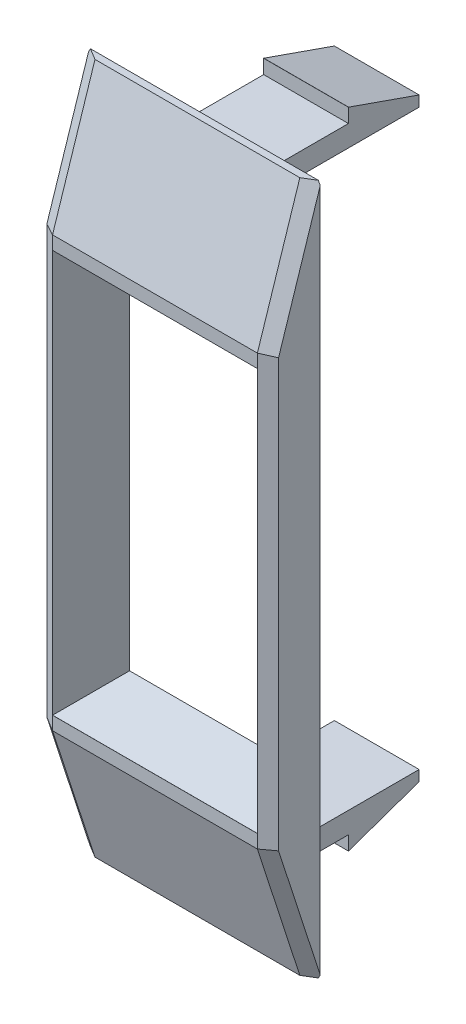
ISO-10303-21;
HEADER;
FILE_DESCRIPTION(('STEP AP214'),'2;1');
FILE_NAME('part.step','',(''),(''),'','','');
FILE_SCHEMA(('AUTOMOTIVE_DESIGN { 1 0 10303 214 1 1 1 1 }'));
ENDSEC;
DATA;
#1=APPLICATION_CONTEXT('core data for automotive mechanical design processes');
#2=APPLICATION_PROTOCOL_DEFINITION('international standard','automotive_design',2000,#1);
#3=PRODUCT_CONTEXT('',#1,'mechanical');
#4=PRODUCT('Part','Part','',(#3));
#5=PRODUCT_RELATED_PRODUCT_CATEGORY('part','',(#4));
#6=PRODUCT_DEFINITION_FORMATION('','',#4);
#7=PRODUCT_DEFINITION_CONTEXT('part definition',#1,'design');
#8=PRODUCT_DEFINITION('design','',#6,#7);
#9=PRODUCT_DEFINITION_SHAPE('','',#8);
#10=(LENGTH_UNIT() NAMED_UNIT(*) SI_UNIT(.MILLI.,.METRE.));
#11=(NAMED_UNIT(*) PLANE_ANGLE_UNIT() SI_UNIT($,.RADIAN.));
#12=(NAMED_UNIT(*) SI_UNIT($,.STERADIAN.) SOLID_ANGLE_UNIT());
#13=UNCERTAINTY_MEASURE_WITH_UNIT(LENGTH_MEASURE(1.E-05),#10,'distance_accuracy_value','');
#14=(GEOMETRIC_REPRESENTATION_CONTEXT(3) GLOBAL_UNCERTAINTY_ASSIGNED_CONTEXT((#13)) GLOBAL_UNIT_ASSIGNED_CONTEXT((#10,
#11,#12)) REPRESENTATION_CONTEXT('',''));
#15=CARTESIAN_POINT('',(0.,0.,0.));
#16=DIRECTION('',(0.,0.,1.));
#17=DIRECTION('',(1.,0.,0.));
#18=AXIS2_PLACEMENT_3D('',#15,#16,#17);
#19=CARTESIAN_POINT('',(-8.2,-24.45,3.5));
#20=DIRECTION('',(0.,0.,1.));
#21=DIRECTION('',(1.,0.,0.));
#22=AXIS2_PLACEMENT_3D('',#19,#20,#21);
#23=PLANE('',#22);
#24=DIRECTION('',(-1.,0.,0.));
#25=VECTOR('',#24,1.);
#26=CARTESIAN_POINT('',(-8.2,15.1999999999999,3.5));
#27=LINE('',#26,#25);
#28=CARTESIAN_POINT('',(7.24999999999999,15.1999999999999,3.5));
#29=VERTEX_POINT('',#28);
#30=CARTESIAN_POINT('',(-7.24999999999999,15.1999999999999,3.5));
#31=VERTEX_POINT('',#30);
#32=EDGE_CURVE('E388',#29,#31,#27,.T.);
#33=ORIENTED_EDGE('',*,*,#32,.T.);
#34=DIRECTION('',(0.,-1.,0.));
#35=VECTOR('',#34,1.);
#36=CARTESIAN_POINT('',(-7.24999999999999,-15.1999999999999,3.5));
#37=LINE('',#36,#35);
#38=CARTESIAN_POINT('',(-7.25,14.25,3.5));
#39=VERTEX_POINT('',#38);
#40=EDGE_CURVE('E430',#31,#39,#37,.T.);
#41=ORIENTED_EDGE('',*,*,#40,.T.);
#42=DIRECTION('',(1.,0.,0.));
#43=VECTOR('',#42,1.);
#44=CARTESIAN_POINT('',(-4.098750431034,14.25,3.5));
#45=LINE('',#44,#43);
#46=CARTESIAN_POINT('',(7.25,14.25,3.5));
#47=VERTEX_POINT('',#46);
#48=EDGE_CURVE('E372',#39,#47,#45,.T.);
#49=ORIENTED_EDGE('',*,*,#48,.T.);
#50=DIRECTION('',(0.,1.,0.));
#51=VECTOR('',#50,1.);
#52=CARTESIAN_POINT('',(7.24999999999999,-24.45,3.5));
#53=LINE('',#52,#51);
#54=EDGE_CURVE('E424',#47,#29,#53,.T.);
#55=ORIENTED_EDGE('',*,*,#54,.T.);
#56=EDGE_LOOP('',(#33,#41,#49,#55));
#57=FACE_BOUND('',#56,.T.);
#58=ADVANCED_FACE('F41',(#57),#23,.T.);
#59=CARTESIAN_POINT('',(-8.2,-24.45,0.));
#60=DIRECTION('',(1.,0.,0.));
#61=DIRECTION('',(0.,1.,0.));
#62=AXIS2_PLACEMENT_3D('',#59,#60,#61);
#63=PLANE('',#62);
#64=DIRECTION('',(0.,1.,0.));
#65=VECTOR('',#64,1.);
#66=CARTESIAN_POINT('',(-8.2,-24.45,0.));
#67=LINE('',#66,#65);
#68=CARTESIAN_POINT('',(-8.2,-24.1969648980842,0.));
#69=VERTEX_POINT('',#68);
#70=CARTESIAN_POINT('',(-8.2,24.1969648980842,0.));
#71=VERTEX_POINT('',#70);
#72=EDGE_CURVE('E347',#69,#71,#67,.T.);
#73=ORIENTED_EDGE('',*,*,#72,.F.);
#74=DIRECTION('',(0.,0.951056516295155,0.309016994374945));
#75=VECTOR('',#74,1.);
#76=CARTESIAN_POINT('',(-8.2,-15.0305095073577,2.97836190108732));
#77=LINE('',#76,#75);
#78=CARTESIAN_POINT('',(-8.2,-15.1131288657059,2.95151724426985));
#79=VERTEX_POINT('',#78);
#80=EDGE_CURVE('E405',#69,#79,#77,.T.);
#81=ORIENTED_EDGE('',*,*,#80,.T.);
#82=DIRECTION('',(0.,1.,0.));
#83=VECTOR('',#82,1.);
#84=CARTESIAN_POINT('',(-8.2,15.1999999999999,2.95151724426985));
#85=LINE('',#84,#83);
#86=CARTESIAN_POINT('',(-8.2,15.1131288657059,2.95151724426985));
#87=VERTEX_POINT('',#86);
#88=EDGE_CURVE('E403',#79,#87,#85,.T.);
#89=ORIENTED_EDGE('',*,*,#88,.T.);
#90=DIRECTION('',(0.,0.951056516295155,-0.309016994374945));
#91=VECTOR('',#90,1.);
#92=CARTESIAN_POINT('',(-8.2,24.2805095073578,-0.0271452890670657));
#93=LINE('',#92,#91);
#94=EDGE_CURVE('E401',#87,#71,#93,.T.);
#95=ORIENTED_EDGE('',*,*,#94,.T.);
#96=EDGE_LOOP('',(#73,#81,#89,#95));
#97=FACE_BOUND('',#96,.T.);
#98=ADVANCED_FACE('F687',(#97),#63,.F.);
#99=CARTESIAN_POINT('',(-8.2,-24.45,0.));
#100=DIRECTION('',(0.,1.,0.));
#101=DIRECTION('',(1.,0.,0.));
#102=AXIS2_PLACEMENT_3D('',#99,#100,#101);
#103=PLANE('',#102);
#104=DIRECTION('',(-1.,0.,0.));
#105=VECTOR('',#104,1.);
#106=CARTESIAN_POINT('',(-8.2,-24.45,0.494492809845614));
#107=LINE('',#106,#105);
#108=CARTESIAN_POINT('',(7.24999999999999,-24.45,0.494492809845614));
#109=VERTEX_POINT('',#108);
#110=CARTESIAN_POINT('',(-7.24999999999999,-24.45,0.494492809845614));
#111=VERTEX_POINT('',#110);
#112=EDGE_CURVE('E395',#109,#111,#107,.T.);
#113=ORIENTED_EDGE('',*,*,#112,.T.);
#114=DIRECTION('',(-0.854818176331533,0.,-0.518927630227213));
#115=VECTOR('',#114,1.);
#116=CARTESIAN_POINT('',(-8.19651741213546,-24.45,-0.0801019417027585));
#117=LINE('',#116,#115);
#118=CARTESIAN_POINT('',(-8.06456722922269,-24.45,0.));
#119=VERTEX_POINT('',#118);
#120=EDGE_CURVE('E414',#111,#119,#117,.T.);
#121=ORIENTED_EDGE('',*,*,#120,.T.);
#122=DIRECTION('',(1.,0.,0.));
#123=VECTOR('',#122,1.);
#124=CARTESIAN_POINT('',(-8.2,-24.45,0.));
#125=LINE('',#124,#123);
#126=CARTESIAN_POINT('',(8.06456722922269,-24.45,0.));
#127=VERTEX_POINT('',#126);
#128=EDGE_CURVE('E392',#119,#127,#125,.T.);
#129=ORIENTED_EDGE('',*,*,#128,.T.);
#130=DIRECTION('',(0.854818176331533,0.,-0.518927630227213));
#131=VECTOR('',#130,1.);
#132=CARTESIAN_POINT('',(8.19651741213546,-24.45,-0.0801019417027585));
#133=LINE('',#132,#131);
#134=EDGE_CURVE('E412',#127,#109,#133,.F.);
#135=ORIENTED_EDGE('',*,*,#134,.T.);
#136=EDGE_LOOP('',(#113,#121,#129,#135));
#137=FACE_BOUND('',#136,.T.);
#138=ADVANCED_FACE('F692',(#137),#103,.F.);
#139=DIRECTION('',(1.,0.,0.));
#140=VECTOR('',#139,1.);
#141=CARTESIAN_POINT('',(-4.098750431034,-14.25,3.5));
#142=LINE('',#141,#140);
#143=CARTESIAN_POINT('',(-7.25,-14.25,3.5));
#144=VERTEX_POINT('',#143);
#145=CARTESIAN_POINT('',(7.25,-14.25,3.5));
#146=VERTEX_POINT('',#145);
#147=EDGE_CURVE('E491',#144,#146,#142,.T.);
#148=ORIENTED_EDGE('',*,*,#147,.F.);
#149=DIRECTION('',(0.,-1.,0.));
#150=VECTOR('',#149,1.);
#151=CARTESIAN_POINT('',(-7.24999999999999,-15.1999999999999,3.5));
#152=LINE('',#151,#150);
#153=CARTESIAN_POINT('',(-7.24999999999999,-15.1999999999999,3.5));
#154=VERTEX_POINT('',#153);
#155=EDGE_CURVE('E428',#144,#154,#152,.T.);
#156=ORIENTED_EDGE('',*,*,#155,.T.);
#157=DIRECTION('',(1.,0.,0.));
#158=VECTOR('',#157,1.);
#159=CARTESIAN_POINT('',(8.2,-15.1999999999999,3.5));
#160=LINE('',#159,#158);
#161=CARTESIAN_POINT('',(7.24999999999999,-15.1999999999999,3.5));
#162=VERTEX_POINT('',#161);
#163=EDGE_CURVE('E391',#154,#162,#160,.T.);
#164=ORIENTED_EDGE('',*,*,#163,.T.);
#165=DIRECTION('',(0.,1.,0.));
#166=VECTOR('',#165,1.);
#167=CARTESIAN_POINT('',(7.24999999999999,-24.45,3.5));
#168=LINE('',#167,#166);
#169=EDGE_CURVE('E426',#162,#146,#168,.T.);
#170=ORIENTED_EDGE('',*,*,#169,.T.);
#171=EDGE_LOOP('',(#148,#156,#164,#170));
#172=FACE_BOUND('',#171,.T.);
#173=ADVANCED_FACE('F490',(#172),#23,.T.);
#174=CARTESIAN_POINT('',(-8.2,24.45,0.));
#175=DIRECTION('',(0.,1.,0.));
#176=DIRECTION('',(1.,0.,0.));
#177=AXIS2_PLACEMENT_3D('',#174,#175,#176);
#178=PLANE('',#177);
#179=DIRECTION('',(1.,0.,0.));
#180=VECTOR('',#179,1.);
#181=CARTESIAN_POINT('',(-8.2,24.45,0.));
#182=LINE('',#181,#180);
#183=CARTESIAN_POINT('',(-8.06456722922269,24.45,0.));
#184=VERTEX_POINT('',#183);
#185=CARTESIAN_POINT('',(8.06456722922269,24.45,0.));
#186=VERTEX_POINT('',#185);
#187=EDGE_CURVE('E342',#184,#186,#182,.T.);
#188=ORIENTED_EDGE('',*,*,#187,.F.);
#189=DIRECTION('',(-0.854818176331534,0.,-0.518927630227212));
#190=VECTOR('',#189,1.);
#191=CARTESIAN_POINT('',(-8.16352986640727,24.45,-0.0600764562770703));
#192=LINE('',#191,#190);
#193=CARTESIAN_POINT('',(-7.24999999999999,24.45,0.494492809845614));
#194=VERTEX_POINT('',#193);
#195=EDGE_CURVE('E434',#184,#194,#192,.F.);
#196=ORIENTED_EDGE('',*,*,#195,.T.);
#197=DIRECTION('',(1.,0.,0.));
#198=VECTOR('',#197,1.);
#199=CARTESIAN_POINT('',(-8.2,24.45,0.494492809845614));
#200=LINE('',#199,#198);
#201=CARTESIAN_POINT('',(7.24999999999999,24.45,0.494492809845614));
#202=VERTEX_POINT('',#201);
#203=EDGE_CURVE('E398',#194,#202,#200,.T.);
#204=ORIENTED_EDGE('',*,*,#203,.T.);
#205=DIRECTION('',(0.854818176331534,0.,-0.518927630227212));
#206=VECTOR('',#205,1.);
#207=CARTESIAN_POINT('',(-3.82018161281575,24.45,7.21477938023241));
#208=LINE('',#207,#206);
#209=EDGE_CURVE('E432',#202,#186,#208,.T.);
#210=ORIENTED_EDGE('',*,*,#209,.T.);
#211=EDGE_LOOP('',(#188,#196,#204,#210));
#212=FACE_BOUND('',#211,.T.);
#213=ADVANCED_FACE('F462',(#212),#178,.T.);
#214=CARTESIAN_POINT('',(-8.2,-24.45,0.));
#215=DIRECTION('',(0.,0.,1.));
#216=DIRECTION('',(1.,0.,0.));
#217=AXIS2_PLACEMENT_3D('',#214,#215,#216);
#218=PLANE('',#217);
#219=ORIENTED_EDGE('',*,*,#128,.F.);
#220=DIRECTION('',(-0.471891765427951,0.881656487369821,0.));
#221=VECTOR('',#220,1.);
#222=CARTESIAN_POINT('',(-8.10477845370252,-24.3748715711418,0.));
#223=LINE('',#222,#221);
#224=EDGE_CURVE('E422',#119,#69,#223,.T.);
#225=ORIENTED_EDGE('',*,*,#224,.T.);
#226=ORIENTED_EDGE('',*,*,#72,.T.);
#227=DIRECTION('',(-0.471891765427951,-0.881656487369821,0.));
#228=VECTOR('',#227,1.);
#229=CARTESIAN_POINT('',(-26.5067060072025,-10.0062725730865,0.));
#230=LINE('',#229,#228);
#231=EDGE_CURVE('E420',#71,#184,#230,.F.);
#232=ORIENTED_EDGE('',*,*,#231,.T.);
#233=ORIENTED_EDGE('',*,*,#187,.T.);
#234=DIRECTION('',(0.471891765427951,-0.881656487369821,0.));
#235=VECTOR('',#234,1.);
#236=CARTESIAN_POINT('',(26.5067060072025,-10.0062725730865,0.));
#237=LINE('',#236,#235);
#238=CARTESIAN_POINT('',(8.2,24.1969648980842,0.));
#239=VERTEX_POINT('',#238);
#240=EDGE_CURVE('E416',#186,#239,#237,.T.);
#241=ORIENTED_EDGE('',*,*,#240,.T.);
#242=DIRECTION('',(0.,1.,0.));
#243=VECTOR('',#242,1.);
#244=CARTESIAN_POINT('',(8.2,-24.45,0.));
#245=LINE('',#244,#243);
#246=CARTESIAN_POINT('',(8.2,-24.1969648980842,0.));
#247=VERTEX_POINT('',#246);
#248=EDGE_CURVE('E506',#247,#239,#245,.T.);
#249=ORIENTED_EDGE('',*,*,#248,.F.);
#250=DIRECTION('',(0.471891765427951,0.881656487369821,0.));
#251=VECTOR('',#250,1.);
#252=CARTESIAN_POINT('',(8.10477845370252,-24.3748715711418,0.));
#253=LINE('',#252,#251);
#254=EDGE_CURVE('E418',#247,#127,#253,.F.);
#255=ORIENTED_EDGE('',*,*,#254,.T.);
#256=EDGE_LOOP('',(#219,#225,#226,#232,#233,#241,#249,#255));
#257=FACE_BOUND('',#256,.T.);
#258=DIRECTION('',(0.,-1.,0.));
#259=VECTOR('',#258,1.);
#260=CARTESIAN_POINT('',(3.,-20.3,0.));
#261=LINE('',#260,#259);
#262=CARTESIAN_POINT('',(3.,-20.3,0.));
#263=VERTEX_POINT('',#262);
#264=CARTESIAN_POINT('',(3.,-21.8,0.));
#265=VERTEX_POINT('',#264);
#266=EDGE_CURVE('E557',#263,#265,#261,.T.);
#267=ORIENTED_EDGE('',*,*,#266,.F.);
#268=DIRECTION('',(1.,0.,0.));
#269=VECTOR('',#268,1.);
#270=CARTESIAN_POINT('',(-3.,-20.3,0.));
#271=LINE('',#270,#269);
#272=CARTESIAN_POINT('',(-3.,-20.3,0.));
#273=VERTEX_POINT('',#272);
#274=EDGE_CURVE('E602',#273,#263,#271,.T.);
#275=ORIENTED_EDGE('',*,*,#274,.F.);
#276=DIRECTION('',(0.,-1.,0.));
#277=VECTOR('',#276,1.);
#278=CARTESIAN_POINT('',(-3.,-20.3,0.));
#279=LINE('',#278,#277);
#280=CARTESIAN_POINT('',(-3.,-21.8,0.));
#281=VERTEX_POINT('',#280);
#282=EDGE_CURVE('E334',#273,#281,#279,.T.);
#283=ORIENTED_EDGE('',*,*,#282,.T.);
#284=DIRECTION('',(1.,0.,0.));
#285=VECTOR('',#284,1.);
#286=CARTESIAN_POINT('',(-3.,-21.8,0.));
#287=LINE('',#286,#285);
#288=EDGE_CURVE('E330',#281,#265,#287,.T.);
#289=ORIENTED_EDGE('',*,*,#288,.T.);
#290=EDGE_LOOP('',(#267,#275,#283,#289));
#291=FACE_BOUND('',#290,.T.);
#292=DIRECTION('',(0.,1.,0.));
#293=VECTOR('',#292,1.);
#294=CARTESIAN_POINT('',(5.298848569435,-11.44391076668,0.));
#295=LINE('',#294,#293);
#296=CARTESIAN_POINT('',(5.298848569435,-12.29884856943,0.));
#297=VERTEX_POINT('',#296);
#298=CARTESIAN_POINT('',(5.298848569435,12.298848569435,0.));
#299=VERTEX_POINT('',#298);
#300=EDGE_CURVE('E335',#297,#299,#295,.T.);
#301=ORIENTED_EDGE('',*,*,#300,.T.);
#302=DIRECTION('',(1.,0.,0.));
#303=VECTOR('',#302,1.);
#304=CARTESIAN_POINT('',(-4.838538791494,12.298848569435,0.));
#305=LINE('',#304,#303);
#306=CARTESIAN_POINT('',(-5.298848569435,12.298848569435,0.));
#307=VERTEX_POINT('',#306);
#308=EDGE_CURVE('E382',#307,#299,#305,.T.);
#309=ORIENTED_EDGE('',*,*,#308,.F.);
#310=DIRECTION('',(0.,-1.,0.));
#311=VECTOR('',#310,1.);
#312=CARTESIAN_POINT('',(-5.298848569435,-11.44391076668,0.));
#313=LINE('',#312,#311);
#314=CARTESIAN_POINT('',(-5.298848569435,-12.29884856943,0.));
#315=VERTEX_POINT('',#314);
#316=EDGE_CURVE('E354',#307,#315,#313,.T.);
#317=ORIENTED_EDGE('',*,*,#316,.T.);
#318=DIRECTION('',(1.,0.,0.));
#319=VECTOR('',#318,1.);
#320=CARTESIAN_POINT('',(-4.338538791494,-12.29884856943,0.));
#321=LINE('',#320,#319);
#322=EDGE_CURVE('E358',#315,#297,#321,.T.);
#323=ORIENTED_EDGE('',*,*,#322,.T.);
#324=EDGE_LOOP('',(#301,#309,#317,#323));
#325=FACE_BOUND('',#324,.T.);
#326=DIRECTION('',(1.,0.,0.));
#327=VECTOR('',#326,1.);
#328=CARTESIAN_POINT('',(-3.,20.3,0.));
#329=LINE('',#328,#327);
#330=CARTESIAN_POINT('',(-3.,20.3,0.));
#331=VERTEX_POINT('',#330);
#332=CARTESIAN_POINT('',(3.,20.3,0.));
#333=VERTEX_POINT('',#332);
#334=EDGE_CURVE('E383',#331,#333,#329,.T.);
#335=ORIENTED_EDGE('',*,*,#334,.T.);
#336=DIRECTION('',(0.,1.,0.));
#337=VECTOR('',#336,1.);
#338=CARTESIAN_POINT('',(3.,20.3,0.));
#339=LINE('',#338,#337);
#340=CARTESIAN_POINT('',(3.,21.8,0.));
#341=VERTEX_POINT('',#340);
#342=EDGE_CURVE('E387',#333,#341,#339,.T.);
#343=ORIENTED_EDGE('',*,*,#342,.T.);
#344=DIRECTION('',(1.,0.,0.));
#345=VECTOR('',#344,1.);
#346=CARTESIAN_POINT('',(-3.,21.8,0.));
#347=LINE('',#346,#345);
#348=CARTESIAN_POINT('',(-3.,21.8,0.));
#349=VERTEX_POINT('',#348);
#350=EDGE_CURVE('E302',#349,#341,#347,.T.);
#351=ORIENTED_EDGE('',*,*,#350,.F.);
#352=DIRECTION('',(0.,1.,0.));
#353=VECTOR('',#352,1.);
#354=CARTESIAN_POINT('',(-3.,20.3,0.));
#355=LINE('',#354,#353);
#356=EDGE_CURVE('E298',#331,#349,#355,.T.);
#357=ORIENTED_EDGE('',*,*,#356,.F.);
#358=EDGE_LOOP('',(#335,#343,#351,#357));
#359=FACE_BOUND('',#358,.T.);
#360=ADVANCED_FACE('F657',(#257,#291,#325,#359),#218,.F.);
#361=CARTESIAN_POINT('',(8.2,-24.45,0.));
#362=DIRECTION('',(1.,0.,0.));
#363=DIRECTION('',(0.,1.,0.));
#364=AXIS2_PLACEMENT_3D('',#361,#362,#363);
#365=PLANE('',#364);
#366=DIRECTION('',(0.,-1.,0.));
#367=VECTOR('',#366,1.);
#368=CARTESIAN_POINT('',(8.2,-24.45,2.95151724426985));
#369=LINE('',#368,#367);
#370=CARTESIAN_POINT('',(8.2,15.1131288657059,2.95151724426985));
#371=VERTEX_POINT('',#370);
#372=CARTESIAN_POINT('',(8.2,-15.1131288657059,2.95151724426985));
#373=VERTEX_POINT('',#372);
#374=EDGE_CURVE('E51',#371,#373,#369,.T.);
#375=ORIENTED_EDGE('',*,*,#374,.T.);
#376=DIRECTION('',(0.,-0.951056516295155,-0.309016994374945));
#377=VECTOR('',#376,1.);
#378=CARTESIAN_POINT('',(8.2,-24.4258372978537,-0.0743651506092102));
#379=LINE('',#378,#377);
#380=EDGE_CURVE('E11',#373,#247,#379,.T.);
#381=ORIENTED_EDGE('',*,*,#380,.T.);
#382=ORIENTED_EDGE('',*,*,#248,.T.);
#383=DIRECTION('',(0.,-0.951056516295155,0.309016994374945));
#384=VECTOR('',#383,1.);
#385=CARTESIAN_POINT('',(8.2,-19.8046282146138,14.2969842679416));
#386=LINE('',#385,#384);
#387=EDGE_CURVE('E62',#239,#371,#386,.T.);
#388=ORIENTED_EDGE('',*,*,#387,.T.);
#389=EDGE_LOOP('',(#375,#381,#382,#388));
#390=FACE_BOUND('',#389,.T.);
#391=ADVANCED_FACE('F709',(#390),#365,.T.);
#392=CARTESIAN_POINT('',(0.002499137931137,-14.25,3.502499137931));
#393=DIRECTION('',(0.,-1.,0.));
#394=DIRECTION('',(0.,0.,-1.));
#395=AXIS2_PLACEMENT_3D('',#392,#393,#394);
#396=PLANE('',#395);
#397=DIRECTION('',(0.,0.,1.));
#398=VECTOR('',#397,1.);
#399=CARTESIAN_POINT('',(-7.25,-14.25,3.495));
#400=LINE('',#399,#398);
#401=CARTESIAN_POINT('',(-7.25,-14.25,3.495));
#402=VERTEX_POINT('',#401);
#403=EDGE_CURVE('E498',#402,#144,#400,.T.);
#404=ORIENTED_EDGE('',*,*,#403,.T.);
#405=ORIENTED_EDGE('',*,*,#147,.T.);
#406=DIRECTION('',(0.,0.,1.));
#407=VECTOR('',#406,1.);
#408=CARTESIAN_POINT('',(7.25,-14.25,3.495));
#409=LINE('',#408,#407);
#410=CARTESIAN_POINT('',(7.25,-14.25,3.495));
#411=VERTEX_POINT('',#410);
#412=EDGE_CURVE('E341',#411,#146,#409,.T.);
#413=ORIENTED_EDGE('',*,*,#412,.F.);
#414=DIRECTION('',(-1.,0.,0.));
#415=VECTOR('',#414,1.);
#416=CARTESIAN_POINT('',(7.25,-14.25,3.495));
#417=LINE('',#416,#415);
#418=EDGE_CURVE('E340',#411,#402,#417,.T.);
#419=ORIENTED_EDGE('',*,*,#418,.T.);
#420=EDGE_LOOP('',(#404,#405,#413,#419));
#421=FACE_BOUND('',#420,.T.);
#422=ADVANCED_FACE('F495',(#421),#396,.F.);
#423=CARTESIAN_POINT('',(7.25,-0.002499561403522,3.497500438596));
#424=DIRECTION('',(-1.,0.,0.));
#425=DIRECTION('',(0.,0.,1.));
#426=AXIS2_PLACEMENT_3D('',#423,#424,#425);
#427=PLANE('',#426);
#428=DIRECTION('',(0.,0.,1.));
#429=VECTOR('',#428,1.);
#430=CARTESIAN_POINT('',(7.25,14.25,3.495));
#431=LINE('',#430,#429);
#432=CARTESIAN_POINT('',(7.25,14.25,3.495));
#433=VERTEX_POINT('',#432);
#434=EDGE_CURVE('E350',#433,#47,#431,.T.);
#435=ORIENTED_EDGE('',*,*,#434,.F.);
#436=DIRECTION('',(0.,-1.,0.));
#437=VECTOR('',#436,1.);
#438=CARTESIAN_POINT('',(7.25,14.25,3.495));
#439=LINE('',#438,#437);
#440=EDGE_CURVE('E336',#433,#411,#439,.T.);
#441=ORIENTED_EDGE('',*,*,#440,.T.);
#442=ORIENTED_EDGE('',*,*,#412,.T.);
#443=DIRECTION('',(0.,-1.,0.));
#444=VECTOR('',#443,1.);
#445=CARTESIAN_POINT('',(7.25,-12.2262497807,3.5));
#446=LINE('',#445,#444);
#447=EDGE_CURVE('E346',#47,#146,#446,.T.);
#448=ORIENTED_EDGE('',*,*,#447,.F.);
#449=EDGE_LOOP('',(#435,#441,#442,#448));
#450=FACE_BOUND('',#449,.T.);
#451=ADVANCED_FACE('F483',(#450),#427,.T.);
#452=CARTESIAN_POINT('',(0.002499137931137,14.25,3.497500862069));
#453=DIRECTION('',(0.,-1.,0.));
#454=DIRECTION('',(0.,0.,-1.));
#455=AXIS2_PLACEMENT_3D('',#452,#453,#454);
#456=PLANE('',#455);
#457=DIRECTION('',(0.,0.,-1.));
#458=VECTOR('',#457,1.);
#459=CARTESIAN_POINT('',(-7.25,14.25,3.505));
#460=LINE('',#459,#458);
#461=CARTESIAN_POINT('',(-7.25,14.25,3.495));
#462=VERTEX_POINT('',#461);
#463=EDGE_CURVE('E527',#39,#462,#460,.T.);
#464=ORIENTED_EDGE('',*,*,#463,.T.);
#465=DIRECTION('',(1.,0.,0.));
#466=VECTOR('',#465,1.);
#467=CARTESIAN_POINT('',(-7.25,14.25,3.495));
#468=LINE('',#467,#466);
#469=EDGE_CURVE('E362',#462,#433,#468,.T.);
#470=ORIENTED_EDGE('',*,*,#469,.T.);
#471=ORIENTED_EDGE('',*,*,#434,.T.);
#472=ORIENTED_EDGE('',*,*,#48,.F.);
#473=EDGE_LOOP('',(#464,#470,#471,#472));
#474=FACE_BOUND('',#473,.T.);
#475=ADVANCED_FACE('F479',(#474),#456,.T.);
#476=CARTESIAN_POINT('',(-7.25,-0.002499561403522,3.497500438596));
#477=DIRECTION('',(-1.,0.,0.));
#478=DIRECTION('',(0.,1.,0.));
#479=AXIS2_PLACEMENT_3D('',#476,#477,#478);
#480=PLANE('',#479);
#481=DIRECTION('',(0.,-1.,0.));
#482=VECTOR('',#481,1.);
#483=CARTESIAN_POINT('',(-7.25,-12.2262497807,3.5));
#484=LINE('',#483,#482);
#485=EDGE_CURVE('E328',#39,#144,#484,.T.);
#486=ORIENTED_EDGE('',*,*,#485,.T.);
#487=ORIENTED_EDGE('',*,*,#403,.F.);
#488=DIRECTION('',(0.,-1.,0.));
#489=VECTOR('',#488,1.);
#490=CARTESIAN_POINT('',(-7.25,14.25,3.495));
#491=LINE('',#490,#489);
#492=EDGE_CURVE('E550',#462,#402,#491,.T.);
#493=ORIENTED_EDGE('',*,*,#492,.F.);
#494=ORIENTED_EDGE('',*,*,#463,.F.);
#495=EDGE_LOOP('',(#486,#487,#493,#494));
#496=FACE_BOUND('',#495,.T.);
#497=ADVANCED_FACE('F682',(#496),#480,.F.);
#498=CARTESIAN_POINT('',(-3.,-21.8,-7.2));
#499=DIRECTION('',(0.,-1.,0.));
#500=DIRECTION('',(0.,0.,-1.));
#501=AXIS2_PLACEMENT_3D('',#498,#499,#500);
#502=PLANE('',#501);
#503=ORIENTED_EDGE('',*,*,#288,.F.);
#504=DIRECTION('',(0.,0.,1.));
#505=VECTOR('',#504,1.);
#506=CARTESIAN_POINT('',(-3.,-21.8,-7.2));
#507=LINE('',#506,#505);
#508=CARTESIAN_POINT('',(-3.,-21.8,-7.195));
#509=VERTEX_POINT('',#508);
#510=EDGE_CURVE('E367',#509,#281,#507,.T.);
#511=ORIENTED_EDGE('',*,*,#510,.F.);
#512=DIRECTION('',(1.,0.,0.));
#513=VECTOR('',#512,1.);
#514=CARTESIAN_POINT('',(-1.75,-21.8,-7.195));
#515=LINE('',#514,#513);
#516=CARTESIAN_POINT('',(3.,-21.8,-7.195));
#517=VERTEX_POINT('',#516);
#518=EDGE_CURVE('E324',#509,#517,#515,.T.);
#519=ORIENTED_EDGE('',*,*,#518,.T.);
#520=DIRECTION('',(0.,0.,1.));
#521=VECTOR('',#520,1.);
#522=CARTESIAN_POINT('',(3.,-21.8,-7.2));
#523=LINE('',#522,#521);
#524=EDGE_CURVE('E329',#517,#265,#523,.T.);
#525=ORIENTED_EDGE('',*,*,#524,.T.);
#526=EDGE_LOOP('',(#503,#511,#519,#525));
#527=FACE_BOUND('',#526,.T.);
#528=ADVANCED_FACE('F654',(#527),#502,.T.);
#529=CARTESIAN_POINT('',(3.,-20.3,-7.2));
#530=DIRECTION('',(1.,0.,0.));
#531=DIRECTION('',(0.,1.,0.));
#532=AXIS2_PLACEMENT_3D('',#529,#530,#531);
#533=PLANE('',#532);
#534=ORIENTED_EDGE('',*,*,#266,.T.);
#535=ORIENTED_EDGE('',*,*,#524,.F.);
#536=DIRECTION('',(0.,1.,0.));
#537=VECTOR('',#536,1.);
#538=CARTESIAN_POINT('',(3.,-22.8,-7.195));
#539=LINE('',#538,#537);
#540=CARTESIAN_POINT('',(3.,-22.8,-7.195));
#541=VERTEX_POINT('',#540);
#542=EDGE_CURVE('E549',#541,#517,#539,.T.);
#543=ORIENTED_EDGE('',*,*,#542,.F.);
#544=DIRECTION('',(0.,0.,1.));
#545=VECTOR('',#544,1.);
#546=CARTESIAN_POINT('',(3.,-22.8,-7.205));
#547=LINE('',#546,#545);
#548=CARTESIAN_POINT('',(3.,-22.8,-7.205));
#549=VERTEX_POINT('',#548);
#550=EDGE_CURVE('E378',#549,#541,#547,.T.);
#551=ORIENTED_EDGE('',*,*,#550,.F.);
#552=DIRECTION('',(0.,-0.330644969861103,0.943755213975293));
#553=VECTOR('',#552,1.);
#554=CARTESIAN_POINT('',(3.,-21.05,-12.2));
#555=LINE('',#554,#553);
#556=CARTESIAN_POINT('',(3.,-21.05,-12.2));
#557=VERTEX_POINT('',#556);
#558=EDGE_CURVE('E531',#557,#549,#555,.T.);
#559=ORIENTED_EDGE('',*,*,#558,.F.);
#560=DIRECTION('',(0.,-1.,0.));
#561=VECTOR('',#560,1.);
#562=CARTESIAN_POINT('',(3.,-20.3,-12.2));
#563=LINE('',#562,#561);
#564=CARTESIAN_POINT('',(3.,-20.3,-12.2));
#565=VERTEX_POINT('',#564);
#566=EDGE_CURVE('E545',#565,#557,#563,.T.);
#567=ORIENTED_EDGE('',*,*,#566,.F.);
#568=DIRECTION('',(0.,0.,1.));
#569=VECTOR('',#568,1.);
#570=CARTESIAN_POINT('',(3.,-20.3,-12.2));
#571=LINE('',#570,#569);
#572=EDGE_CURVE('E553',#565,#263,#571,.T.);
#573=ORIENTED_EDGE('',*,*,#572,.T.);
#574=EDGE_LOOP('',(#534,#535,#543,#551,#559,#567,#573));
#575=FACE_BOUND('',#574,.T.);
#576=ADVANCED_FACE('F674',(#575),#533,.T.);
#577=CARTESIAN_POINT('',(-3.,-20.3,-7.2));
#578=DIRECTION('',(0.,-1.,0.));
#579=DIRECTION('',(0.,0.,-1.));
#580=AXIS2_PLACEMENT_3D('',#577,#578,#579);
#581=PLANE('',#580);
#582=ORIENTED_EDGE('',*,*,#572,.F.);
#583=DIRECTION('',(-1.,0.,0.));
#584=VECTOR('',#583,1.);
#585=CARTESIAN_POINT('',(3.,-20.3,-12.2));
#586=LINE('',#585,#584);
#587=CARTESIAN_POINT('',(-3.,-20.3,-12.2));
#588=VERTEX_POINT('',#587);
#589=EDGE_CURVE('E558',#565,#588,#586,.T.);
#590=ORIENTED_EDGE('',*,*,#589,.T.);
#591=DIRECTION('',(0.,0.,1.));
#592=VECTOR('',#591,1.);
#593=CARTESIAN_POINT('',(-3.,-20.3,-12.2));
#594=LINE('',#593,#592);
#595=EDGE_CURVE('E567',#588,#273,#594,.T.);
#596=ORIENTED_EDGE('',*,*,#595,.T.);
#597=ORIENTED_EDGE('',*,*,#274,.T.);
#598=EDGE_LOOP('',(#582,#590,#596,#597));
#599=FACE_BOUND('',#598,.T.);
#600=ADVANCED_FACE('F661',(#599),#581,.F.);
#601=CARTESIAN_POINT('',(-3.,-20.3,-7.2));
#602=DIRECTION('',(1.,0.,0.));
#603=DIRECTION('',(0.,1.,0.));
#604=AXIS2_PLACEMENT_3D('',#601,#602,#603);
#605=PLANE('',#604);
#606=ORIENTED_EDGE('',*,*,#595,.F.);
#607=DIRECTION('',(0.,-1.,0.));
#608=VECTOR('',#607,1.);
#609=CARTESIAN_POINT('',(-3.,-20.3,-12.2));
#610=LINE('',#609,#608);
#611=CARTESIAN_POINT('',(-3.,-21.05,-12.2));
#612=VERTEX_POINT('',#611);
#613=EDGE_CURVE('E523',#588,#612,#610,.T.);
#614=ORIENTED_EDGE('',*,*,#613,.T.);
#615=DIRECTION('',(0.,0.330644969861103,-0.943755213975293));
#616=VECTOR('',#615,1.);
#617=CARTESIAN_POINT('',(-3.,-22.8,-7.205));
#618=LINE('',#617,#616);
#619=CARTESIAN_POINT('',(-3.,-22.8,-7.205));
#620=VERTEX_POINT('',#619);
#621=EDGE_CURVE('E538',#620,#612,#618,.T.);
#622=ORIENTED_EDGE('',*,*,#621,.F.);
#623=DIRECTION('',(0.,0.,1.));
#624=VECTOR('',#623,1.);
#625=CARTESIAN_POINT('',(-3.,-22.8,-7.205));
#626=LINE('',#625,#624);
#627=CARTESIAN_POINT('',(-3.,-22.8,-7.195));
#628=VERTEX_POINT('',#627);
#629=EDGE_CURVE('E519',#620,#628,#626,.T.);
#630=ORIENTED_EDGE('',*,*,#629,.T.);
#631=DIRECTION('',(0.,1.,0.));
#632=VECTOR('',#631,1.);
#633=CARTESIAN_POINT('',(-3.,-22.8,-7.195));
#634=LINE('',#633,#632);
#635=EDGE_CURVE('E524',#628,#509,#634,.T.);
#636=ORIENTED_EDGE('',*,*,#635,.T.);
#637=ORIENTED_EDGE('',*,*,#510,.T.);
#638=ORIENTED_EDGE('',*,*,#282,.F.);
#639=EDGE_LOOP('',(#606,#614,#622,#630,#636,#637,#638));
#640=FACE_BOUND('',#639,.T.);
#641=ADVANCED_FACE('F645',(#640),#605,.F.);
#642=CARTESIAN_POINT('',(-0.477077582988,-13.70002248713,2.509852780083));
#643=DIRECTION('',(0.,-0.873149455006179,-0.4874525917691));
#644=DIRECTION('',(0.,0.4874525917691,-0.873149455006179));
#645=AXIS2_PLACEMENT_3D('',#642,#643,#644);
#646=PLANE('',#645);
#647=ORIENTED_EDGE('',*,*,#322,.F.);
#648=DIRECTION('',(0.438167814904957,0.438167814904957,-0.784868098448924));
#649=VECTOR('',#648,1.);
#650=CARTESIAN_POINT('',(-7.25,-14.25,3.495));
#651=LINE('',#650,#649);
#652=EDGE_CURVE('E368',#402,#315,#651,.T.);
#653=ORIENTED_EDGE('',*,*,#652,.F.);
#654=ORIENTED_EDGE('',*,*,#418,.F.);
#655=DIRECTION('',(-0.438167814904957,0.438167814904957,-0.784868098448924));
#656=VECTOR('',#655,1.);
#657=CARTESIAN_POINT('',(7.25,-14.25,3.495));
#658=LINE('',#657,#656);
#659=EDGE_CURVE('E363',#411,#297,#658,.T.);
#660=ORIENTED_EDGE('',*,*,#659,.T.);
#661=EDGE_LOOP('',(#647,#653,#654,#660));
#662=FACE_BOUND('',#661,.T.);
#663=ADVANCED_FACE('F909',(#662),#646,.F.);
#664=CARTESIAN_POINT('',(-5.811562123274,1.562178466629,0.918398153314));
#665=DIRECTION('',(-0.873149455006179,0.,-0.4874525917691));
#666=DIRECTION('',(-0.4874525917691,0.,0.873149455006179));
#667=AXIS2_PLACEMENT_3D('',#664,#665,#666);
#668=PLANE('',#667);
#669=ORIENTED_EDGE('',*,*,#652,.T.);
#670=ORIENTED_EDGE('',*,*,#316,.F.);
#671=DIRECTION('',(0.438167814904957,-0.438167814904957,-0.784868098448924));
#672=VECTOR('',#671,1.);
#673=CARTESIAN_POINT('',(-7.25,14.25,3.495));
#674=LINE('',#673,#672);
#675=EDGE_CURVE('E319',#462,#307,#674,.T.);
#676=ORIENTED_EDGE('',*,*,#675,.F.);
#677=ORIENTED_EDGE('',*,*,#492,.T.);
#678=EDGE_LOOP('',(#669,#670,#676,#677));
#679=FACE_BOUND('',#678,.T.);
#680=ADVANCED_FACE('F901',(#679),#668,.F.);
#681=CARTESIAN_POINT('',(5.811562123274,1.562178466629,0.918398153314));
#682=DIRECTION('',(0.873149455006179,0.,-0.4874525917691));
#683=DIRECTION('',(0.,-1.,0.));
#684=AXIS2_PLACEMENT_3D('',#681,#682,#683);
#685=PLANE('',#684);
#686=ORIENTED_EDGE('',*,*,#440,.F.);
#687=DIRECTION('',(0.438167814904957,0.438167814904957,0.784868098448924));
#688=VECTOR('',#687,1.);
#689=CARTESIAN_POINT('',(5.25,12.25,-0.0875));
#690=LINE('',#689,#688);
#691=EDGE_CURVE('E322',#299,#433,#690,.T.);
#692=ORIENTED_EDGE('',*,*,#691,.F.);
#693=ORIENTED_EDGE('',*,*,#300,.F.);
#694=ORIENTED_EDGE('',*,*,#659,.F.);
#695=EDGE_LOOP('',(#686,#692,#693,#694));
#696=FACE_BOUND('',#695,.T.);
#697=ADVANCED_FACE('F891',(#696),#685,.F.);
#698=CARTESIAN_POINT('',(-1.477077582988,12.87793152898,1.037282351286));
#699=DIRECTION('',(0.,-0.873149455006179,0.4874525917691));
#700=DIRECTION('',(-1.,0.,0.));
#701=AXIS2_PLACEMENT_3D('',#698,#699,#700);
#702=PLANE('',#701);
#703=ORIENTED_EDGE('',*,*,#469,.F.);
#704=ORIENTED_EDGE('',*,*,#675,.T.);
#705=ORIENTED_EDGE('',*,*,#308,.T.);
#706=ORIENTED_EDGE('',*,*,#691,.T.);
#707=EDGE_LOOP('',(#703,#704,#705,#706));
#708=FACE_BOUND('',#707,.T.);
#709=ADVANCED_FACE('F884',(#708),#702,.T.);
#710=CARTESIAN_POINT('',(-3.,20.3,-7.2));
#711=DIRECTION('',(1.,0.,0.));
#712=DIRECTION('',(0.,1.,0.));
#713=AXIS2_PLACEMENT_3D('',#710,#711,#712);
#714=PLANE('',#713);
#715=ORIENTED_EDGE('',*,*,#356,.T.);
#716=DIRECTION('',(0.,0.,1.));
#717=VECTOR('',#716,1.);
#718=CARTESIAN_POINT('',(-3.,21.8,-7.2));
#719=LINE('',#718,#717);
#720=CARTESIAN_POINT('',(-3.,21.8,-7.195));
#721=VERTEX_POINT('',#720);
#722=EDGE_CURVE('E295',#721,#349,#719,.T.);
#723=ORIENTED_EDGE('',*,*,#722,.F.);
#724=DIRECTION('',(0.,-1.,0.));
#725=VECTOR('',#724,1.);
#726=CARTESIAN_POINT('',(-3.,22.8,-7.195));
#727=LINE('',#726,#725);
#728=CARTESIAN_POINT('',(-3.,22.8,-7.195));
#729=VERTEX_POINT('',#728);
#730=EDGE_CURVE('E281',#729,#721,#727,.T.);
#731=ORIENTED_EDGE('',*,*,#730,.F.);
#732=DIRECTION('',(0.,0.,1.));
#733=VECTOR('',#732,1.);
#734=CARTESIAN_POINT('',(-3.,22.8,-7.205));
#735=LINE('',#734,#733);
#736=CARTESIAN_POINT('',(-3.,22.8,-7.205));
#737=VERTEX_POINT('',#736);
#738=EDGE_CURVE('E515',#737,#729,#735,.T.);
#739=ORIENTED_EDGE('',*,*,#738,.F.);
#740=DIRECTION('',(0.,-0.330644969861103,-0.943755213975293));
#741=VECTOR('',#740,1.);
#742=CARTESIAN_POINT('',(-3.,22.8,-7.205));
#743=LINE('',#742,#741);
#744=CARTESIAN_POINT('',(-3.,21.05,-12.2));
#745=VERTEX_POINT('',#744);
#746=EDGE_CURVE('E323',#737,#745,#743,.T.);
#747=ORIENTED_EDGE('',*,*,#746,.T.);
#748=DIRECTION('',(0.,1.,0.));
#749=VECTOR('',#748,1.);
#750=CARTESIAN_POINT('',(-3.,20.3,-12.2));
#751=LINE('',#750,#749);
#752=CARTESIAN_POINT('',(-3.,20.3,-12.2));
#753=VERTEX_POINT('',#752);
#754=EDGE_CURVE('E574',#753,#745,#751,.T.);
#755=ORIENTED_EDGE('',*,*,#754,.F.);
#756=DIRECTION('',(0.,0.,1.));
#757=VECTOR('',#756,1.);
#758=CARTESIAN_POINT('',(-3.,20.3,-12.2));
#759=LINE('',#758,#757);
#760=EDGE_CURVE('E301',#753,#331,#759,.T.);
#761=ORIENTED_EDGE('',*,*,#760,.T.);
#762=EDGE_LOOP('',(#715,#723,#731,#739,#747,#755,#761));
#763=FACE_BOUND('',#762,.T.);
#764=ADVANCED_FACE('F296',(#763),#714,.F.);
#765=CARTESIAN_POINT('',(-3.,21.8,-7.2));
#766=DIRECTION('',(0.,1.,0.));
#767=DIRECTION('',(1.,0.,0.));
#768=AXIS2_PLACEMENT_3D('',#765,#766,#767);
#769=PLANE('',#768);
#770=DIRECTION('',(0.,0.,1.));
#771=VECTOR('',#770,1.);
#772=CARTESIAN_POINT('',(3.,21.8,-7.2));
#773=LINE('',#772,#771);
#774=CARTESIAN_POINT('',(3.,21.8,-7.195));
#775=VERTEX_POINT('',#774);
#776=EDGE_CURVE('E306',#775,#341,#773,.T.);
#777=ORIENTED_EDGE('',*,*,#776,.F.);
#778=DIRECTION('',(1.,0.,0.));
#779=VECTOR('',#778,1.);
#780=CARTESIAN_POINT('',(-1.75,21.8,-7.195));
#781=LINE('',#780,#779);
#782=EDGE_CURVE('E285',#721,#775,#781,.T.);
#783=ORIENTED_EDGE('',*,*,#782,.F.);
#784=ORIENTED_EDGE('',*,*,#722,.T.);
#785=ORIENTED_EDGE('',*,*,#350,.T.);
#786=EDGE_LOOP('',(#777,#783,#784,#785));
#787=FACE_BOUND('',#786,.T.);
#788=ADVANCED_FACE('F304',(#787),#769,.T.);
#789=CARTESIAN_POINT('',(-3.,20.3,-7.2));
#790=DIRECTION('',(0.,1.,0.));
#791=DIRECTION('',(1.,0.,0.));
#792=AXIS2_PLACEMENT_3D('',#789,#790,#791);
#793=PLANE('',#792);
#794=ORIENTED_EDGE('',*,*,#334,.F.);
#795=ORIENTED_EDGE('',*,*,#760,.F.);
#796=DIRECTION('',(-1.,0.,0.));
#797=VECTOR('',#796,1.);
#798=CARTESIAN_POINT('',(3.,20.3,-12.2));
#799=LINE('',#798,#797);
#800=CARTESIAN_POINT('',(3.,20.3,-12.2));
#801=VERTEX_POINT('',#800);
#802=EDGE_CURVE('E570',#801,#753,#799,.T.);
#803=ORIENTED_EDGE('',*,*,#802,.F.);
#804=DIRECTION('',(0.,0.,1.));
#805=VECTOR('',#804,1.);
#806=CARTESIAN_POINT('',(3.,20.3,-12.2));
#807=LINE('',#806,#805);
#808=EDGE_CURVE('E594',#801,#333,#807,.T.);
#809=ORIENTED_EDGE('',*,*,#808,.T.);
#810=EDGE_LOOP('',(#794,#795,#803,#809));
#811=FACE_BOUND('',#810,.T.);
#812=ADVANCED_FACE('F861',(#811),#793,.F.);
#813=CARTESIAN_POINT('',(3.,20.3,-7.2));
#814=DIRECTION('',(1.,0.,0.));
#815=DIRECTION('',(0.,1.,0.));
#816=AXIS2_PLACEMENT_3D('',#813,#814,#815);
#817=PLANE('',#816);
#818=ORIENTED_EDGE('',*,*,#808,.F.);
#819=DIRECTION('',(0.,1.,0.));
#820=VECTOR('',#819,1.);
#821=CARTESIAN_POINT('',(3.,20.3,-12.2));
#822=LINE('',#821,#820);
#823=CARTESIAN_POINT('',(3.,21.05,-12.2));
#824=VERTEX_POINT('',#823);
#825=EDGE_CURVE('E536',#801,#824,#822,.T.);
#826=ORIENTED_EDGE('',*,*,#825,.T.);
#827=DIRECTION('',(0.,0.330644969861103,0.943755213975293));
#828=VECTOR('',#827,1.);
#829=CARTESIAN_POINT('',(3.,21.05,-12.2));
#830=LINE('',#829,#828);
#831=CARTESIAN_POINT('',(3.,22.8,-7.205));
#832=VERTEX_POINT('',#831);
#833=EDGE_CURVE('E532',#824,#832,#830,.T.);
#834=ORIENTED_EDGE('',*,*,#833,.T.);
#835=DIRECTION('',(0.,0.,1.));
#836=VECTOR('',#835,1.);
#837=CARTESIAN_POINT('',(3.,22.8,-7.205));
#838=LINE('',#837,#836);
#839=CARTESIAN_POINT('',(3.,22.8,-7.195));
#840=VERTEX_POINT('',#839);
#841=EDGE_CURVE('E537',#832,#840,#838,.T.);
#842=ORIENTED_EDGE('',*,*,#841,.T.);
#843=DIRECTION('',(0.,-1.,0.));
#844=VECTOR('',#843,1.);
#845=CARTESIAN_POINT('',(3.,22.8,-7.195));
#846=LINE('',#845,#844);
#847=EDGE_CURVE('E585',#840,#775,#846,.T.);
#848=ORIENTED_EDGE('',*,*,#847,.T.);
#849=ORIENTED_EDGE('',*,*,#776,.T.);
#850=ORIENTED_EDGE('',*,*,#342,.F.);
#851=EDGE_LOOP('',(#818,#826,#834,#842,#848,#849,#850));
#852=FACE_BOUND('',#851,.T.);
#853=ADVANCED_FACE('F853',(#852),#817,.T.);
#854=CARTESIAN_POINT('',(-0.5,-22.05,-7.195));
#855=DIRECTION('',(0.,0.,1.));
#856=DIRECTION('',(1.,0.,0.));
#857=AXIS2_PLACEMENT_3D('',#854,#855,#856);
#858=PLANE('',#857);
#859=ORIENTED_EDGE('',*,*,#518,.F.);
#860=ORIENTED_EDGE('',*,*,#635,.F.);
#861=DIRECTION('',(-1.,0.,0.));
#862=VECTOR('',#861,1.);
#863=CARTESIAN_POINT('',(3.,-22.8,-7.195));
#864=LINE('',#863,#862);
#865=EDGE_CURVE('E377',#541,#628,#864,.T.);
#866=ORIENTED_EDGE('',*,*,#865,.F.);
#867=ORIENTED_EDGE('',*,*,#542,.T.);
#868=EDGE_LOOP('',(#859,#860,#866,#867));
#869=FACE_BOUND('',#868,.T.);
#870=ADVANCED_FACE('F651',(#869),#858,.T.);
#871=CARTESIAN_POINT('',(-0.175826672194,-20.4991733278,-12.2));
#872=DIRECTION('',(0.,0.,-1.));
#873=DIRECTION('',(0.,-1.,0.));
#874=AXIS2_PLACEMENT_3D('',#871,#872,#873);
#875=PLANE('',#874);
#876=ORIENTED_EDGE('',*,*,#566,.T.);
#877=DIRECTION('',(-1.,0.,0.));
#878=VECTOR('',#877,1.);
#879=CARTESIAN_POINT('',(3.,-21.05,-12.2));
#880=LINE('',#879,#878);
#881=EDGE_CURVE('E541',#557,#612,#880,.T.);
#882=ORIENTED_EDGE('',*,*,#881,.T.);
#883=ORIENTED_EDGE('',*,*,#613,.F.);
#884=ORIENTED_EDGE('',*,*,#589,.F.);
#885=EDGE_LOOP('',(#876,#882,#883,#884));
#886=FACE_BOUND('',#885,.T.);
#887=ADVANCED_FACE('F666',(#886),#875,.T.);
#888=CARTESIAN_POINT('',(-0.822975804215,-21.65288719001,-10.4791877062));
#889=DIRECTION('',(0.,0.943755213975293,0.330644969861103));
#890=DIRECTION('',(1.,0.,0.));
#891=AXIS2_PLACEMENT_3D('',#888,#889,#890);
#892=PLANE('',#891);
#893=ORIENTED_EDGE('',*,*,#621,.T.);
#894=ORIENTED_EDGE('',*,*,#881,.F.);
#895=ORIENTED_EDGE('',*,*,#558,.T.);
#896=DIRECTION('',(1.,0.,0.));
#897=VECTOR('',#896,1.);
#898=CARTESIAN_POINT('',(-3.,-22.8,-7.205));
#899=LINE('',#898,#897);
#900=EDGE_CURVE('E373',#620,#549,#899,.T.);
#901=ORIENTED_EDGE('',*,*,#900,.F.);
#902=EDGE_LOOP('',(#893,#894,#895,#901));
#903=FACE_BOUND('',#902,.T.);
#904=ADVANCED_FACE('F672',(#903),#892,.F.);
#905=CARTESIAN_POINT('',(-0.002497916668113,-22.8,-7.197502083332));
#906=DIRECTION('',(0.,1.,0.));
#907=DIRECTION('',(0.,0.,-1.));
#908=AXIS2_PLACEMENT_3D('',#905,#906,#907);
#909=PLANE('',#908);
#910=ORIENTED_EDGE('',*,*,#865,.T.);
#911=ORIENTED_EDGE('',*,*,#629,.F.);
#912=ORIENTED_EDGE('',*,*,#900,.T.);
#913=ORIENTED_EDGE('',*,*,#550,.T.);
#914=EDGE_LOOP('',(#910,#911,#912,#913));
#915=FACE_BOUND('',#914,.T.);
#916=ADVANCED_FACE('F671',(#915),#909,.F.);
#917=CARTESIAN_POINT('',(-0.175826672194,20.499173327806,-12.2));
#918=DIRECTION('',(0.,0.,-1.));
#919=DIRECTION('',(0.,-1.,0.));
#920=AXIS2_PLACEMENT_3D('',#917,#918,#919);
#921=PLANE('',#920);
#922=ORIENTED_EDGE('',*,*,#802,.T.);
#923=ORIENTED_EDGE('',*,*,#754,.T.);
#924=DIRECTION('',(-1.,0.,0.));
#925=VECTOR('',#924,1.);
#926=CARTESIAN_POINT('',(3.,21.05,-12.2));
#927=LINE('',#926,#925);
#928=EDGE_CURVE('E518',#824,#745,#927,.T.);
#929=ORIENTED_EDGE('',*,*,#928,.F.);
#930=ORIENTED_EDGE('',*,*,#825,.F.);
#931=EDGE_LOOP('',(#922,#923,#929,#930));
#932=FACE_BOUND('',#931,.T.);
#933=ADVANCED_FACE('F814',(#932),#921,.T.);
#934=CARTESIAN_POINT('',(-0.822975804215,21.652887190019,-10.4791877062));
#935=DIRECTION('',(0.,-0.943755213975293,0.330644969861103));
#936=DIRECTION('',(-1.,0.,0.));
#937=AXIS2_PLACEMENT_3D('',#934,#935,#936);
#938=PLANE('',#937);
#939=DIRECTION('',(1.,0.,0.));
#940=VECTOR('',#939,1.);
#941=CARTESIAN_POINT('',(-3.,22.8,-7.205));
#942=LINE('',#941,#940);
#943=EDGE_CURVE('E577',#737,#832,#942,.T.);
#944=ORIENTED_EDGE('',*,*,#943,.T.);
#945=ORIENTED_EDGE('',*,*,#833,.F.);
#946=ORIENTED_EDGE('',*,*,#928,.T.);
#947=ORIENTED_EDGE('',*,*,#746,.F.);
#948=EDGE_LOOP('',(#944,#945,#946,#947));
#949=FACE_BOUND('',#948,.T.);
#950=ADVANCED_FACE('F803',(#949),#938,.F.);
#951=CARTESIAN_POINT('',(-0.002497916668113,22.8,-7.197502083332));
#952=DIRECTION('',(0.,-1.,0.));
#953=DIRECTION('',(-1.,0.,0.));
#954=AXIS2_PLACEMENT_3D('',#951,#952,#953);
#955=PLANE('',#954);
#956=ORIENTED_EDGE('',*,*,#841,.F.);
#957=ORIENTED_EDGE('',*,*,#943,.F.);
#958=ORIENTED_EDGE('',*,*,#738,.T.);
#959=DIRECTION('',(-1.,0.,0.));
#960=VECTOR('',#959,1.);
#961=CARTESIAN_POINT('',(3.,22.8,-7.195));
#962=LINE('',#961,#960);
#963=EDGE_CURVE('E288',#840,#729,#962,.T.);
#964=ORIENTED_EDGE('',*,*,#963,.F.);
#965=EDGE_LOOP('',(#956,#957,#958,#964));
#966=FACE_BOUND('',#965,.T.);
#967=ADVANCED_FACE('F725',(#966),#955,.F.);
#968=CARTESIAN_POINT('',(-0.5,22.05,-7.195));
#969=DIRECTION('',(0.,0.,1.));
#970=DIRECTION('',(1.,0.,0.));
#971=AXIS2_PLACEMENT_3D('',#968,#969,#970);
#972=PLANE('',#971);
#973=ORIENTED_EDGE('',*,*,#847,.F.);
#974=ORIENTED_EDGE('',*,*,#963,.T.);
#975=ORIENTED_EDGE('',*,*,#730,.T.);
#976=ORIENTED_EDGE('',*,*,#782,.T.);
#977=EDGE_LOOP('',(#973,#974,#975,#976));
#978=FACE_BOUND('',#977,.T.);
#979=ADVANCED_FACE('F283',(#978),#972,.T.);
#980=CARTESIAN_POINT('',(-8.2,-15.1999999999999,3.5));
#981=DIRECTION('',(0.,-0.309016994374945,0.951056516295155));
#982=DIRECTION('',(-1.,0.,0.));
#983=AXIS2_PLACEMENT_3D('',#980,#981,#982);
#984=PLANE('',#983);
#985=ORIENTED_EDGE('',*,*,#163,.F.);
#986=DIRECTION('',(0.,-0.951056516295155,-0.309016994374945));
#987=VECTOR('',#986,1.);
#988=CARTESIAN_POINT('',(-7.24999999999999,-24.45,0.494492809845614));
#989=LINE('',#988,#987);
#990=EDGE_CURVE('E410',#154,#111,#989,.T.);
#991=ORIENTED_EDGE('',*,*,#990,.T.);
#992=ORIENTED_EDGE('',*,*,#112,.F.);
#993=DIRECTION('',(0.,0.951056516295155,0.309016994374945));
#994=VECTOR('',#993,1.);
#995=CARTESIAN_POINT('',(7.24999999999999,-15.1999999999999,3.5));
#996=LINE('',#995,#994);
#997=EDGE_CURVE('E408',#109,#162,#996,.T.);
#998=ORIENTED_EDGE('',*,*,#997,.T.);
#999=EDGE_LOOP('',(#985,#991,#992,#998));
#1000=FACE_BOUND('',#999,.T.);
#1001=ADVANCED_FACE('F724',(#1000),#984,.T.);
#1002=CARTESIAN_POINT('',(-8.2,24.45,0.494492809845614));
#1003=DIRECTION('',(0.,-0.309016994374945,-0.951056516295155));
#1004=DIRECTION('',(1.,0.,0.));
#1005=AXIS2_PLACEMENT_3D('',#1002,#1003,#1004);
#1006=PLANE('',#1005);
#1007=ORIENTED_EDGE('',*,*,#203,.F.);
#1008=DIRECTION('',(0.,0.951056516295155,-0.309016994374945));
#1009=VECTOR('',#1008,1.);
#1010=CARTESIAN_POINT('',(-7.24999999999999,15.1999999999999,3.5));
#1011=LINE('',#1010,#1009);
#1012=EDGE_CURVE('E438',#194,#31,#1011,.F.);
#1013=ORIENTED_EDGE('',*,*,#1012,.T.);
#1014=ORIENTED_EDGE('',*,*,#32,.F.);
#1015=DIRECTION('',(0.,-0.951056516295155,0.309016994374945));
#1016=VECTOR('',#1015,1.);
#1017=CARTESIAN_POINT('',(7.24999999999999,24.45,0.494492809845614));
#1018=LINE('',#1017,#1016);
#1019=EDGE_CURVE('E436',#29,#202,#1018,.F.);
#1020=ORIENTED_EDGE('',*,*,#1019,.T.);
#1021=EDGE_LOOP('',(#1007,#1013,#1014,#1020));
#1022=FACE_BOUND('',#1021,.T.);
#1023=ADVANCED_FACE('F458',(#1022),#1006,.F.);
#1024=CARTESIAN_POINT('',(-8.2,-19.8046282146138,14.2969842679416));
#1025=DIRECTION('',(0.499999999999998,-0.267616567329816,-0.823639103546334));
#1026=DIRECTION('',(0.,0.951056516295155,-0.309016994374945));
#1027=AXIS2_PLACEMENT_3D('',#1024,#1025,#1026);
#1028=PLANE('',#1027);
#1029=ORIENTED_EDGE('',*,*,#231,.F.);
#1030=ORIENTED_EDGE('',*,*,#94,.F.);
#1031=DIRECTION('',(-0.863322511159669,-0.0789450587431196,-0.498439484215495));
#1032=VECTOR('',#1031,1.);
#1033=CARTESIAN_POINT('',(-5.6977077473915,15.3419467249892,4.39621634990448));
#1034=LINE('',#1033,#1032);
#1035=EDGE_CURVE('E309',#31,#87,#1034,.T.);
#1036=ORIENTED_EDGE('',*,*,#1035,.F.);
#1037=ORIENTED_EDGE('',*,*,#1012,.F.);
#1038=ORIENTED_EDGE('',*,*,#195,.F.);
#1039=EDGE_LOOP('',(#1029,#1030,#1036,#1037,#1038));
#1040=FACE_BOUND('',#1039,.T.);
#1041=ADVANCED_FACE('F466',(#1040),#1028,.F.);
#1042=CARTESIAN_POINT('',(-8.2,-24.45,2.95151724426985));
#1043=DIRECTION('',(-0.499999999999998,0.,0.86602540378444));
#1044=DIRECTION('',(0.,-1.,0.));
#1045=AXIS2_PLACEMENT_3D('',#1042,#1043,#1044);
#1046=PLANE('',#1045);
#1047=ORIENTED_EDGE('',*,*,#1035,.T.);
#1048=ORIENTED_EDGE('',*,*,#88,.F.);
#1049=DIRECTION('',(0.863322511159669,-0.0789450587431222,0.498439484215495));
#1050=VECTOR('',#1049,1.);
#1051=CARTESIAN_POINT('',(-7.56364511500576,-15.171319255888,3.31891690842141));
#1052=LINE('',#1051,#1050);
#1053=EDGE_CURVE('E315',#154,#79,#1052,.F.);
#1054=ORIENTED_EDGE('',*,*,#1053,.F.);
#1055=ORIENTED_EDGE('',*,*,#155,.F.);
#1056=ORIENTED_EDGE('',*,*,#485,.F.);
#1057=ORIENTED_EDGE('',*,*,#40,.F.);
#1058=EDGE_LOOP('',(#1047,#1048,#1054,#1055,#1056,#1057));
#1059=FACE_BOUND('',#1058,.T.);
#1060=ADVANCED_FACE('F745',(#1059),#1046,.T.);
#1061=CARTESIAN_POINT('',(-8.2,-24.4258372978537,-0.0743651506092102));
#1062=DIRECTION('',(-0.499999999999998,-0.267616567329815,0.823639103546334));
#1063=DIRECTION('',(0.,-0.951056516295155,-0.309016994374945));
#1064=AXIS2_PLACEMENT_3D('',#1061,#1062,#1063);
#1065=PLANE('',#1064);
#1066=ORIENTED_EDGE('',*,*,#120,.F.);
#1067=ORIENTED_EDGE('',*,*,#990,.F.);
#1068=ORIENTED_EDGE('',*,*,#1053,.T.);
#1069=ORIENTED_EDGE('',*,*,#80,.F.);
#1070=ORIENTED_EDGE('',*,*,#224,.F.);
#1071=EDGE_LOOP('',(#1066,#1067,#1068,#1069,#1070));
#1072=FACE_BOUND('',#1071,.T.);
#1073=ADVANCED_FACE('F739',(#1072),#1065,.T.);
#1074=CARTESIAN_POINT('',(8.2,-19.8046282146138,14.2969842679416));
#1075=DIRECTION('',(0.499999999999998,0.267616567329816,0.823639103546334));
#1076=DIRECTION('',(0.,0.951056516295155,-0.309016994374945));
#1077=AXIS2_PLACEMENT_3D('',#1074,#1075,#1076);
#1078=PLANE('',#1077);
#1079=ORIENTED_EDGE('',*,*,#209,.F.);
#1080=ORIENTED_EDGE('',*,*,#1019,.F.);
#1081=DIRECTION('',(-0.863322511159669,0.0789450587431196,0.498439484215495));
#1082=VECTOR('',#1081,1.);
#1083=CARTESIAN_POINT('',(5.6977077473915,15.3419467249892,4.39621634990448));
#1084=LINE('',#1083,#1082);
#1085=EDGE_CURVE('E46',#371,#29,#1084,.T.);
#1086=ORIENTED_EDGE('',*,*,#1085,.F.);
#1087=ORIENTED_EDGE('',*,*,#387,.F.);
#1088=ORIENTED_EDGE('',*,*,#240,.F.);
#1089=EDGE_LOOP('',(#1079,#1080,#1086,#1087,#1088));
#1090=FACE_BOUND('',#1089,.T.);
#1091=ADVANCED_FACE('F44',(#1090),#1078,.T.);
#1092=CARTESIAN_POINT('',(7.24999999999999,-24.45,3.5));
#1093=DIRECTION('',(-0.499999999999998,0.,-0.86602540378444));
#1094=DIRECTION('',(0.,1.,0.));
#1095=AXIS2_PLACEMENT_3D('',#1092,#1093,#1094);
#1096=PLANE('',#1095);
#1097=ORIENTED_EDGE('',*,*,#447,.T.);
#1098=ORIENTED_EDGE('',*,*,#169,.F.);
#1099=DIRECTION('',(0.863322511159669,0.0789450587431222,-0.498439484215495));
#1100=VECTOR('',#1099,1.);
#1101=CARTESIAN_POINT('',(6.61956582119071,-15.2576489812745,3.86398134284188));
#1102=LINE('',#1101,#1100);
#1103=EDGE_CURVE('E442',#373,#162,#1102,.F.);
#1104=ORIENTED_EDGE('',*,*,#1103,.F.);
#1105=ORIENTED_EDGE('',*,*,#374,.F.);
#1106=ORIENTED_EDGE('',*,*,#1085,.T.);
#1107=ORIENTED_EDGE('',*,*,#54,.F.);
#1108=EDGE_LOOP('',(#1097,#1098,#1104,#1105,#1106,#1107));
#1109=FACE_BOUND('',#1108,.T.);
#1110=ADVANCED_FACE('F450',(#1109),#1096,.F.);
#1111=CARTESIAN_POINT('',(8.2,-24.4258372978537,-0.0743651506092102));
#1112=DIRECTION('',(-0.499999999999998,0.267616567329815,-0.823639103546334));
#1113=DIRECTION('',(0.,-0.951056516295155,-0.309016994374945));
#1114=AXIS2_PLACEMENT_3D('',#1111,#1112,#1113);
#1115=PLANE('',#1114);
#1116=ORIENTED_EDGE('',*,*,#1103,.T.);
#1117=ORIENTED_EDGE('',*,*,#997,.F.);
#1118=ORIENTED_EDGE('',*,*,#134,.F.);
#1119=ORIENTED_EDGE('',*,*,#254,.F.);
#1120=ORIENTED_EDGE('',*,*,#380,.F.);
#1121=EDGE_LOOP('',(#1116,#1117,#1118,#1119,#1120));
#1122=FACE_BOUND('',#1121,.T.);
#1123=ADVANCED_FACE('F757',(#1122),#1115,.F.);
#1124=CLOSED_SHELL('',(#58,#98,#138,#173,#213,#360,#391,#422,#451,#475,#497,#528,#576,#600,#641,
#663,#680,#697,#709,#764,#788,#812,#853,#870,#887,#904,#916,#933,#950,#967,#979,#1001,#1023,
#1041,#1060,#1073,#1091,#1110,#1123));
#1125=MANIFOLD_SOLID_BREP('B2',#1124);
#1126=ADVANCED_BREP_SHAPE_REPRESENTATION('',(#18,#1125),#14);
#1127=SHAPE_DEFINITION_REPRESENTATION(#9,#1126);
ENDSEC;
END-ISO-10303-21;
